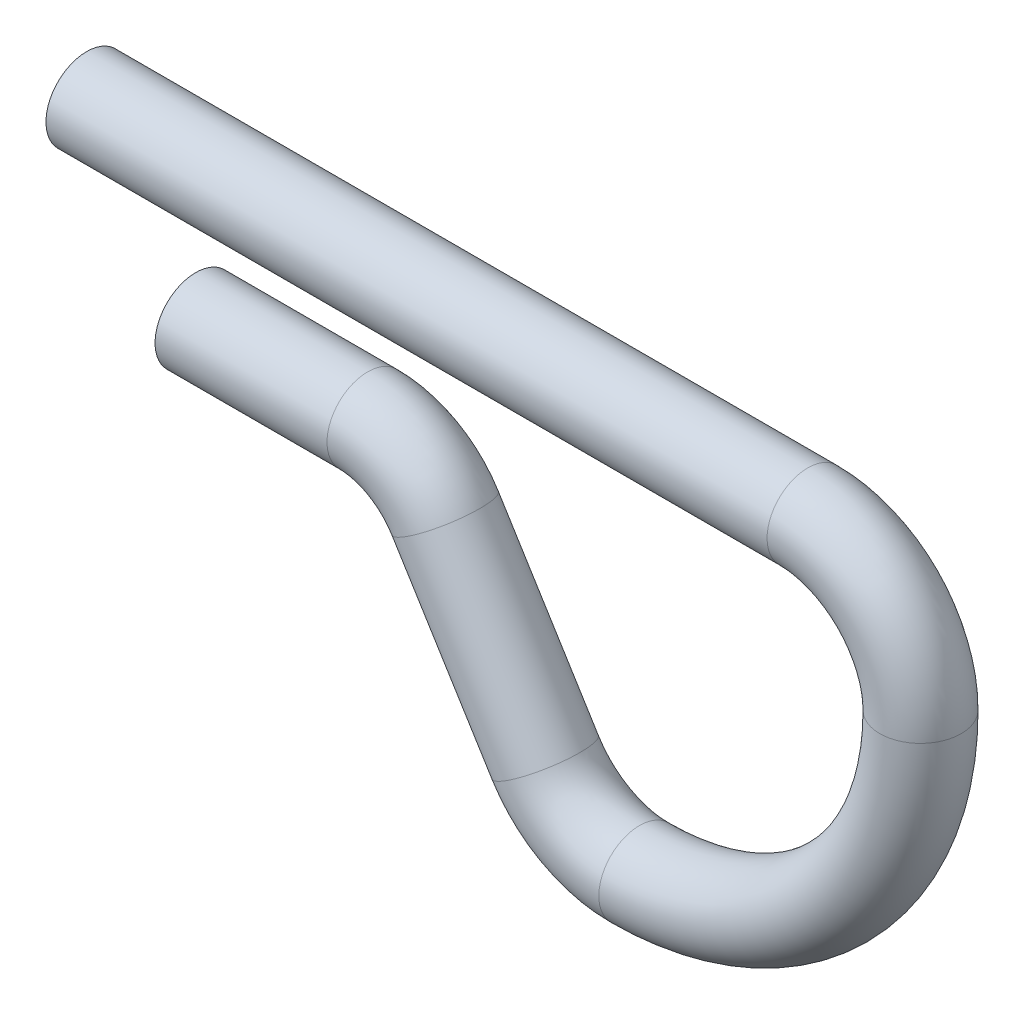
ISO-10303-21;
HEADER;
FILE_DESCRIPTION(('STEP AP214'),'2;1');
FILE_NAME('part.step','',(''),(''),'','','');
FILE_SCHEMA(('AUTOMOTIVE_DESIGN { 1 0 10303 214 1 1 1 1 }'));
ENDSEC;
DATA;
#1=APPLICATION_CONTEXT('core data for automotive mechanical design processes');
#2=APPLICATION_PROTOCOL_DEFINITION('international standard','automotive_design',2000,#1);
#3=PRODUCT_CONTEXT('',#1,'mechanical');
#4=PRODUCT('Part','Part','',(#3));
#5=PRODUCT_RELATED_PRODUCT_CATEGORY('part','',(#4));
#6=PRODUCT_DEFINITION_FORMATION('','',#4);
#7=PRODUCT_DEFINITION_CONTEXT('part definition',#1,'design');
#8=PRODUCT_DEFINITION('design','',#6,#7);
#9=PRODUCT_DEFINITION_SHAPE('','',#8);
#10=(LENGTH_UNIT() NAMED_UNIT(*) SI_UNIT(.MILLI.,.METRE.));
#11=(NAMED_UNIT(*) PLANE_ANGLE_UNIT() SI_UNIT($,.RADIAN.));
#12=(NAMED_UNIT(*) SI_UNIT($,.STERADIAN.) SOLID_ANGLE_UNIT());
#13=UNCERTAINTY_MEASURE_WITH_UNIT(LENGTH_MEASURE(1.E-05),#10,'distance_accuracy_value','');
#14=(GEOMETRIC_REPRESENTATION_CONTEXT(3) GLOBAL_UNCERTAINTY_ASSIGNED_CONTEXT((#13)) GLOBAL_UNIT_ASSIGNED_CONTEXT((#10,
#11,#12)) REPRESENTATION_CONTEXT('',''));
#15=CARTESIAN_POINT('',(0.,0.,0.));
#16=DIRECTION('',(0.,0.,1.));
#17=DIRECTION('',(1.,0.,0.));
#18=AXIS2_PLACEMENT_3D('',#15,#16,#17);
#19=CARTESIAN_POINT('',(-14.986,18.796,0.));
#20=DIRECTION('',(1.,0.,0.));
#21=DIRECTION('',(0.,0.,-1.));
#22=AXIS2_PLACEMENT_3D('',#19,#20,#21);
#23=PLANE('',#22);
#24=CARTESIAN_POINT('',(-14.986,18.796,0.));
#25=DIRECTION('',(1.,0.,0.));
#26=DIRECTION('',(0.,0.,-1.));
#27=AXIS2_PLACEMENT_3D('',#24,#25,#26);
#28=CIRCLE('',#27,5.588);
#29=CARTESIAN_POINT('',(-14.986,18.796,-5.588));
#30=VERTEX_POINT('',#29);
#31=EDGE_CURVE('E49',#30,#30,#28,.T.);
#32=ORIENTED_EDGE('',*,*,#31,.F.);
#33=EDGE_LOOP('',(#32));
#34=FACE_BOUND('',#33,.T.);
#35=ADVANCED_FACE('F37',(#34),#23,.F.);
#36=CARTESIAN_POINT('',(0.,0.,0.));
#37=DIRECTION('',(-1.,0.,0.));
#38=DIRECTION('',(0.,0.,-1.));
#39=AXIS2_PLACEMENT_3D('',#36,#37,#38);
#40=PLANE('',#39);
#41=CARTESIAN_POINT('',(0.,0.,0.));
#42=DIRECTION('',(-1.,0.,0.));
#43=DIRECTION('',(0.,0.,-1.));
#44=AXIS2_PLACEMENT_3D('',#41,#42,#43);
#45=CIRCLE('',#44,5.588);
#46=CARTESIAN_POINT('',(0.,0.,-5.588));
#47=VERTEX_POINT('',#46);
#48=EDGE_CURVE('E11',#47,#47,#45,.T.);
#49=ORIENTED_EDGE('',*,*,#48,.T.);
#50=EDGE_LOOP('',(#49));
#51=FACE_BOUND('',#50,.T.);
#52=ADVANCED_FACE('F52',(#51),#40,.T.);
#53=CARTESIAN_POINT('',(-14.986,18.796,0.));
#54=DIRECTION('',(1.,0.,0.));
#55=DIRECTION('',(0.,1.,0.));
#56=AXIS2_PLACEMENT_3D('',#53,#54,#55);
#57=CYLINDRICAL_SURFACE('',#56,5.588);
#58=CARTESIAN_POINT('',(84.074,18.796,0.));
#59=DIRECTION('',(1.,0.,0.));
#60=DIRECTION('',(0.,0.,-1.));
#61=AXIS2_PLACEMENT_3D('',#58,#59,#60);
#62=CIRCLE('',#61,5.588);
#63=CARTESIAN_POINT('',(84.074,24.384,0.));
#64=VERTEX_POINT('',#63);
#65=EDGE_CURVE('E75',#64,#64,#62,.T.);
#66=ORIENTED_EDGE('',*,*,#65,.F.);
#67=EDGE_LOOP('',(#66));
#68=FACE_BOUND('',#67,.T.);
#69=ORIENTED_EDGE('',*,*,#31,.T.);
#70=EDGE_LOOP('',(#69));
#71=FACE_BOUND('',#70,.T.);
#72=ADVANCED_FACE('F79',(#68,#71),#57,.T.);
#73=CARTESIAN_POINT('',(84.074,3.30199999999999,0.));
#74=DIRECTION('',(0.,0.,-1.));
#75=DIRECTION('',(-1.,0.,0.));
#76=AXIS2_PLACEMENT_3D('',#73,#74,#75);
#77=TOROIDAL_SURFACE('',#76,15.494,5.588);
#78=CARTESIAN_POINT('',(99.568,3.30199999999999,0.));
#79=DIRECTION('',(0.,-1.,0.));
#80=DIRECTION('',(0.,0.,-1.));
#81=AXIS2_PLACEMENT_3D('',#78,#79,#80);
#82=CIRCLE('',#81,5.588);
#83=CARTESIAN_POINT('',(105.156,3.30199999999999,0.));
#84=VERTEX_POINT('',#83);
#85=EDGE_CURVE('E72',#84,#84,#82,.T.);
#86=CARTESIAN_POINT('',(84.074,3.30199999999999,0.));
#87=DIRECTION('',(0.,0.,-1.));
#88=DIRECTION('',(-1.,0.,0.));
#89=AXIS2_PLACEMENT_3D('',#86,#87,#88);
#90=CIRCLE('',#89,21.082);
#91=EDGE_CURVE('',#64,#84,#90,.T.);
#92=ORIENTED_EDGE('',*,*,#65,.T.);
#93=ORIENTED_EDGE('',*,*,#85,.F.);
#94=ORIENTED_EDGE('',*,*,#91,.T.);
#95=ORIENTED_EDGE('',*,*,#91,.F.);
#96=EDGE_LOOP('',(#92,#94,#93,#95));
#97=FACE_BOUND('',#96,.T.);
#98=ADVANCED_FACE('F81',(#97),#77,.T.);
#99=CARTESIAN_POINT('',(60.96,3.30199999999999,0.));
#100=DIRECTION('',(0.,0.,-1.));
#101=DIRECTION('',(-1.,0.,0.));
#102=AXIS2_PLACEMENT_3D('',#99,#100,#101);
#103=TOROIDAL_SURFACE('',#102,38.608,5.588);
#104=CARTESIAN_POINT('',(60.96,-35.306,0.));
#105=DIRECTION('',(-1.,0.,0.));
#106=DIRECTION('',(0.,0.,-1.));
#107=AXIS2_PLACEMENT_3D('',#104,#105,#106);
#108=CIRCLE('',#107,5.588);
#109=CARTESIAN_POINT('',(60.96,-40.894,0.));
#110=VERTEX_POINT('',#109);
#111=EDGE_CURVE('E69',#110,#110,#108,.T.);
#112=CARTESIAN_POINT('',(60.96,3.30199999999999,0.));
#113=DIRECTION('',(0.,0.,-1.));
#114=DIRECTION('',(-1.,0.,0.));
#115=AXIS2_PLACEMENT_3D('',#112,#113,#114);
#116=CIRCLE('',#115,44.196);
#117=EDGE_CURVE('',#84,#110,#116,.T.);
#118=ORIENTED_EDGE('',*,*,#85,.T.);
#119=ORIENTED_EDGE('',*,*,#111,.F.);
#120=ORIENTED_EDGE('',*,*,#117,.T.);
#121=ORIENTED_EDGE('',*,*,#117,.F.);
#122=EDGE_LOOP('',(#118,#120,#119,#121));
#123=FACE_BOUND('',#122,.T.);
#124=ADVANCED_FACE('F88',(#123),#103,.T.);
#125=CARTESIAN_POINT('',(60.96,-20.066,0.));
#126=DIRECTION('',(0.,0.,-1.));
#127=DIRECTION('',(-1.,0.,0.));
#128=AXIS2_PLACEMENT_3D('',#125,#126,#127);
#129=TOROIDAL_SURFACE('',#128,15.24,5.588);
#130=CARTESIAN_POINT('',(48.006,-28.0941681596738,0.));
#131=DIRECTION('',(-0.526782687642635,0.850000000000001,0.));
#132=DIRECTION('',(0.,0.,-1.));
#133=AXIS2_PLACEMENT_3D('',#130,#131,#132);
#134=CIRCLE('',#133,5.588);
#135=CARTESIAN_POINT('',(43.2562,-31.0378298182208,0.));
#136=VERTEX_POINT('',#135);
#137=EDGE_CURVE('E64',#136,#136,#134,.T.);
#138=CARTESIAN_POINT('',(60.96,-20.066,0.));
#139=DIRECTION('',(0.,0.,-1.));
#140=DIRECTION('',(-1.,0.,0.));
#141=AXIS2_PLACEMENT_3D('',#138,#139,#140);
#142=CIRCLE('',#141,20.828);
#143=EDGE_CURVE('',#110,#136,#142,.T.);
#144=ORIENTED_EDGE('',*,*,#111,.T.);
#145=ORIENTED_EDGE('',*,*,#137,.F.);
#146=ORIENTED_EDGE('',*,*,#143,.T.);
#147=ORIENTED_EDGE('',*,*,#143,.F.);
#148=EDGE_LOOP('',(#144,#146,#145,#147));
#149=FACE_BOUND('',#148,.T.);
#150=ADVANCED_FACE('F95',(#149),#129,.T.);
#151=CARTESIAN_POINT('',(48.006,-28.0941681596738,0.));
#152=DIRECTION('',(-0.526782687642635,0.850000000000001,0.));
#153=DIRECTION('',(-0.850000000000001,-0.526782687642635,0.));
#154=AXIS2_PLACEMENT_3D('',#151,#152,#153);
#155=CYLINDRICAL_SURFACE('',#154,5.588);
#156=CARTESIAN_POINT('',(34.2679477913056,-5.92687858976292,0.));
#157=DIRECTION('',(-0.526782687642635,0.850000000000001,0.));
#158=DIRECTION('',(0.,0.,-1.));
#159=AXIS2_PLACEMENT_3D('',#156,#157,#158);
#160=CIRCLE('',#159,5.588);
#161=CARTESIAN_POINT('',(39.0177477913057,-2.98321693121586,0.));
#162=VERTEX_POINT('',#161);
#163=EDGE_CURVE('E62',#162,#162,#160,.T.);
#164=ORIENTED_EDGE('',*,*,#163,.F.);
#165=EDGE_LOOP('',(#164));
#166=FACE_BOUND('',#165,.T.);
#167=ORIENTED_EDGE('',*,*,#137,.T.);
#168=EDGE_LOOP('',(#167));
#169=FACE_BOUND('',#168,.T.);
#170=ADVANCED_FACE('F99',(#166,#169),#155,.T.);
#171=CARTESIAN_POINT('',(23.622,-12.5246444603596,0.));
#172=DIRECTION('',(0.,0.,1.));
#173=DIRECTION('',(1.,0.,0.));
#174=AXIS2_PLACEMENT_3D('',#171,#172,#173);
#175=TOROIDAL_SURFACE('',#174,12.5246444603596,5.588);
#176=CARTESIAN_POINT('',(23.622,0.,0.));
#177=DIRECTION('',(-1.,0.,0.));
#178=DIRECTION('',(0.,0.,-1.));
#179=AXIS2_PLACEMENT_3D('',#176,#177,#178);
#180=CIRCLE('',#179,5.588);
#181=CARTESIAN_POINT('',(23.622,5.58800000000001,0.));
#182=VERTEX_POINT('',#181);
#183=EDGE_CURVE('E44',#182,#182,#180,.T.);
#184=CARTESIAN_POINT('',(23.622,-12.5246444603596,0.));
#185=DIRECTION('',(0.,0.,1.));
#186=DIRECTION('',(1.,0.,0.));
#187=AXIS2_PLACEMENT_3D('',#184,#185,#186);
#188=CIRCLE('',#187,18.1126444603596);
#189=EDGE_CURVE('',#162,#182,#188,.T.);
#190=ORIENTED_EDGE('',*,*,#163,.T.);
#191=ORIENTED_EDGE('',*,*,#183,.F.);
#192=ORIENTED_EDGE('',*,*,#189,.T.);
#193=ORIENTED_EDGE('',*,*,#189,.F.);
#194=EDGE_LOOP('',(#190,#192,#191,#193));
#195=FACE_BOUND('',#194,.T.);
#196=ADVANCED_FACE('F57',(#195),#175,.T.);
#197=CARTESIAN_POINT('',(23.622,0.,0.));
#198=DIRECTION('',(-1.,0.,0.));
#199=DIRECTION('',(0.,-1.,0.));
#200=AXIS2_PLACEMENT_3D('',#197,#198,#199);
#201=CYLINDRICAL_SURFACE('',#200,5.588);
#202=ORIENTED_EDGE('',*,*,#48,.F.);
#203=EDGE_LOOP('',(#202));
#204=FACE_BOUND('',#203,.T.);
#205=ORIENTED_EDGE('',*,*,#183,.T.);
#206=EDGE_LOOP('',(#205));
#207=FACE_BOUND('',#206,.T.);
#208=ADVANCED_FACE('F54',(#204,#207),#201,.T.);
#209=CLOSED_SHELL('',(#35,#52,#72,#98,#124,#150,#170,#196,#208));
#210=MANIFOLD_SOLID_BREP('B2',#209);
#211=ADVANCED_BREP_SHAPE_REPRESENTATION('',(#18,#210),#14);
#212=SHAPE_DEFINITION_REPRESENTATION(#9,#211);
ENDSEC;
END-ISO-10303-21;
